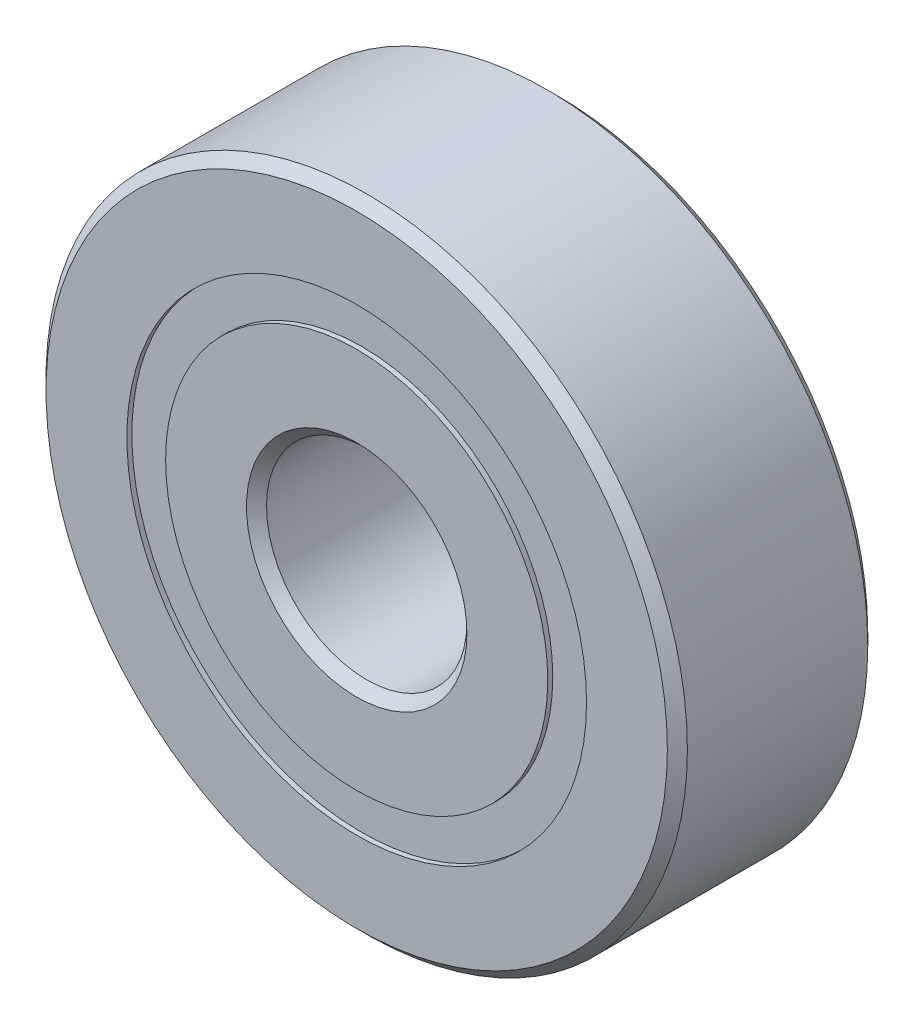
ISO-10303-21;
HEADER;
FILE_DESCRIPTION(('STEP AP214'),'2;1');
FILE_NAME('part.step','',(''),(''),'','','');
FILE_SCHEMA(('AUTOMOTIVE_DESIGN { 1 0 10303 214 1 1 1 1 }'));
ENDSEC;
DATA;
#1=APPLICATION_CONTEXT('core data for automotive mechanical design processes');
#2=APPLICATION_PROTOCOL_DEFINITION('international standard','automotive_design',2000,#1);
#3=PRODUCT_CONTEXT('',#1,'mechanical');
#4=PRODUCT('Part','Part','',(#3));
#5=PRODUCT_RELATED_PRODUCT_CATEGORY('part','',(#4));
#6=PRODUCT_DEFINITION_FORMATION('','',#4);
#7=PRODUCT_DEFINITION_CONTEXT('part definition',#1,'design');
#8=PRODUCT_DEFINITION('design','',#6,#7);
#9=PRODUCT_DEFINITION_SHAPE('','',#8);
#10=(LENGTH_UNIT() NAMED_UNIT(*) SI_UNIT(.MILLI.,.METRE.));
#11=(NAMED_UNIT(*) PLANE_ANGLE_UNIT() SI_UNIT($,.RADIAN.));
#12=(NAMED_UNIT(*) SI_UNIT($,.STERADIAN.) SOLID_ANGLE_UNIT());
#13=UNCERTAINTY_MEASURE_WITH_UNIT(LENGTH_MEASURE(1.E-05),#10,'distance_accuracy_value','');
#14=(GEOMETRIC_REPRESENTATION_CONTEXT(3) GLOBAL_UNCERTAINTY_ASSIGNED_CONTEXT((#13)) GLOBAL_UNIT_ASSIGNED_CONTEXT((#10,
#11,#12)) REPRESENTATION_CONTEXT('',''));
#15=CARTESIAN_POINT('',(0.,0.,0.));
#16=DIRECTION('',(0.,0.,1.));
#17=DIRECTION('',(1.,0.,0.));
#18=AXIS2_PLACEMENT_3D('',#15,#16,#17);
#19=CARTESIAN_POINT('',(0.,5.73351648351648,-2.375));
#20=DIRECTION('',(0.,0.,1.));
#21=DIRECTION('',(1.,0.,0.));
#22=AXIS2_PLACEMENT_3D('',#19,#20,#21);
#23=PLANE('',#22);
#24=CARTESIAN_POINT('',(0.,0.,-2.375));
#25=DIRECTION('',(0.,0.,1.));
#26=DIRECTION('',(1.,0.,0.));
#27=AXIS2_PLACEMENT_3D('',#24,#25,#26);
#28=CIRCLE('',#27,5.73351648351648);
#29=CARTESIAN_POINT('',(5.73351648351648,0.,-2.375));
#30=VERTEX_POINT('',#29);
#31=EDGE_CURVE('E57',#30,#30,#28,.T.);
#32=ORIENTED_EDGE('',*,*,#31,.F.);
#33=EDGE_LOOP('',(#32));
#34=FACE_BOUND('',#33,.T.);
#35=CARTESIAN_POINT('',(0.,0.,-2.375));
#36=DIRECTION('',(0.,0.,1.));
#37=DIRECTION('',(1.,0.,0.));
#38=AXIS2_PLACEMENT_3D('',#35,#36,#37);
#39=CIRCLE('',#38,4.76648351648352);
#40=CARTESIAN_POINT('',(4.76648351648352,0.,-2.375));
#41=VERTEX_POINT('',#40);
#42=EDGE_CURVE('E11',#41,#41,#39,.T.);
#43=ORIENTED_EDGE('',*,*,#42,.T.);
#44=EDGE_LOOP('',(#43));
#45=FACE_BOUND('',#44,.T.);
#46=ADVANCED_FACE('F43',(#34,#45),#23,.F.);
#47=CARTESIAN_POINT('',(0.,0.,2.5));
#48=DIRECTION('',(0.,0.,1.));
#49=DIRECTION('',(1.,0.,0.));
#50=AXIS2_PLACEMENT_3D('',#47,#48,#49);
#51=CYLINDRICAL_SURFACE('',#50,4.76648351648352);
#52=ORIENTED_EDGE('',*,*,#42,.F.);
#53=EDGE_LOOP('',(#52));
#54=FACE_BOUND('',#53,.T.);
#55=CARTESIAN_POINT('',(0.,0.,-1.21175743903915));
#56=DIRECTION('',(0.,0.,1.));
#57=DIRECTION('',(1.,0.,0.));
#58=AXIS2_PLACEMENT_3D('',#55,#56,#57);
#59=CIRCLE('',#58,4.76648351648352);
#60=CARTESIAN_POINT('',(4.76648351648352,0.,-1.21175743903915));
#61=VERTEX_POINT('',#60);
#62=EDGE_CURVE('E49',#61,#61,#59,.T.);
#63=ORIENTED_EDGE('',*,*,#62,.T.);
#64=EDGE_LOOP('',(#63));
#65=FACE_BOUND('',#64,.T.);
#66=ADVANCED_FACE('F66',(#54,#65),#51,.F.);
#67=CARTESIAN_POINT('',(0.,5.73351648351648,-1.21175743903915));
#68=DIRECTION('',(0.,0.,-1.));
#69=DIRECTION('',(-1.,0.,0.));
#70=AXIS2_PLACEMENT_3D('',#67,#68,#69);
#71=PLANE('',#70);
#72=ORIENTED_EDGE('',*,*,#62,.F.);
#73=EDGE_LOOP('',(#72));
#74=FACE_BOUND('',#73,.T.);
#75=CARTESIAN_POINT('',(0.,0.,-1.21175743903915));
#76=DIRECTION('',(0.,0.,1.));
#77=DIRECTION('',(1.,0.,0.));
#78=AXIS2_PLACEMENT_3D('',#75,#76,#77);
#79=CIRCLE('',#78,5.73351648351648);
#80=CARTESIAN_POINT('',(5.73351648351648,0.,-1.21175743903915));
#81=VERTEX_POINT('',#80);
#82=EDGE_CURVE('E53',#81,#81,#79,.T.);
#83=ORIENTED_EDGE('',*,*,#82,.T.);
#84=EDGE_LOOP('',(#83));
#85=FACE_BOUND('',#84,.T.);
#86=ADVANCED_FACE('F70',(#74,#85),#71,.F.);
#87=CARTESIAN_POINT('',(0.,0.,2.5));
#88=DIRECTION('',(0.,0.,1.));
#89=DIRECTION('',(1.,0.,0.));
#90=AXIS2_PLACEMENT_3D('',#87,#88,#89);
#91=CYLINDRICAL_SURFACE('',#90,5.73351648351648);
#92=ORIENTED_EDGE('',*,*,#82,.F.);
#93=EDGE_LOOP('',(#92));
#94=FACE_BOUND('',#93,.T.);
#95=ORIENTED_EDGE('',*,*,#31,.T.);
#96=EDGE_LOOP('',(#95));
#97=FACE_BOUND('',#96,.T.);
#98=ADVANCED_FACE('F63',(#94,#97),#91,.T.);
#99=CLOSED_SHELL('',(#46,#66,#86,#98));
#100=MANIFOLD_SOLID_BREP('B2',#99);
#101=CARTESIAN_POINT('',(0.,5.73351648351648,2.375));
#102=DIRECTION('',(0.,0.,-1.));
#103=DIRECTION('',(-1.,0.,0.));
#104=AXIS2_PLACEMENT_3D('',#101,#102,#103);
#105=PLANE('',#104);
#106=CARTESIAN_POINT('',(0.,0.,2.375));
#107=DIRECTION('',(0.,0.,1.));
#108=DIRECTION('',(1.,0.,0.));
#109=AXIS2_PLACEMENT_3D('',#106,#107,#108);
#110=CIRCLE('',#109,4.76648351648352);
#111=CARTESIAN_POINT('',(4.76648351648352,0.,2.375));
#112=VERTEX_POINT('',#111);
#113=EDGE_CURVE('E42',#112,#112,#110,.T.);
#114=ORIENTED_EDGE('',*,*,#113,.F.);
#115=EDGE_LOOP('',(#114));
#116=FACE_BOUND('',#115,.T.);
#117=CARTESIAN_POINT('',(0.,0.,2.375));
#118=DIRECTION('',(0.,0.,1.));
#119=DIRECTION('',(1.,0.,0.));
#120=AXIS2_PLACEMENT_3D('',#117,#118,#119);
#121=CIRCLE('',#120,5.73351648351648);
#122=CARTESIAN_POINT('',(5.73351648351648,0.,2.375));
#123=VERTEX_POINT('',#122);
#124=EDGE_CURVE('E124',#123,#123,#121,.T.);
#125=ORIENTED_EDGE('',*,*,#124,.T.);
#126=EDGE_LOOP('',(#125));
#127=FACE_BOUND('',#126,.T.);
#128=ADVANCED_FACE('F110',(#116,#127),#105,.F.);
#129=CARTESIAN_POINT('',(0.,0.,2.5));
#130=DIRECTION('',(0.,0.,1.));
#131=DIRECTION('',(1.,0.,0.));
#132=AXIS2_PLACEMENT_3D('',#129,#130,#131);
#133=CYLINDRICAL_SURFACE('',#132,4.76648351648352);
#134=CARTESIAN_POINT('',(0.,0.,1.21175743903915));
#135=DIRECTION('',(0.,0.,1.));
#136=DIRECTION('',(1.,0.,0.));
#137=AXIS2_PLACEMENT_3D('',#134,#135,#136);
#138=CIRCLE('',#137,4.76648351648352);
#139=CARTESIAN_POINT('',(4.76648351648352,0.,1.21175743903915));
#140=VERTEX_POINT('',#139);
#141=EDGE_CURVE('E116',#140,#140,#138,.T.);
#142=ORIENTED_EDGE('',*,*,#141,.F.);
#143=EDGE_LOOP('',(#142));
#144=FACE_BOUND('',#143,.T.);
#145=ORIENTED_EDGE('',*,*,#113,.T.);
#146=EDGE_LOOP('',(#145));
#147=FACE_BOUND('',#146,.T.);
#148=ADVANCED_FACE('F139',(#144,#147),#133,.F.);
#149=CARTESIAN_POINT('',(0.,5.73351648351648,1.21175743903915));
#150=DIRECTION('',(0.,0.,1.));
#151=DIRECTION('',(1.,0.,0.));
#152=AXIS2_PLACEMENT_3D('',#149,#150,#151);
#153=PLANE('',#152);
#154=CARTESIAN_POINT('',(0.,0.,1.21175743903915));
#155=DIRECTION('',(0.,0.,1.));
#156=DIRECTION('',(1.,0.,0.));
#157=AXIS2_PLACEMENT_3D('',#154,#155,#156);
#158=CIRCLE('',#157,5.73351648351648);
#159=CARTESIAN_POINT('',(5.73351648351648,0.,1.21175743903915));
#160=VERTEX_POINT('',#159);
#161=EDGE_CURVE('E120',#160,#160,#158,.T.);
#162=ORIENTED_EDGE('',*,*,#161,.F.);
#163=EDGE_LOOP('',(#162));
#164=FACE_BOUND('',#163,.T.);
#165=ORIENTED_EDGE('',*,*,#141,.T.);
#166=EDGE_LOOP('',(#165));
#167=FACE_BOUND('',#166,.T.);
#168=ADVANCED_FACE('F134',(#164,#167),#153,.F.);
#169=CARTESIAN_POINT('',(0.,0.,2.5));
#170=DIRECTION('',(0.,0.,1.));
#171=DIRECTION('',(1.,0.,0.));
#172=AXIS2_PLACEMENT_3D('',#169,#170,#171);
#173=CYLINDRICAL_SURFACE('',#172,5.73351648351648);
#174=ORIENTED_EDGE('',*,*,#124,.F.);
#175=EDGE_LOOP('',(#174));
#176=FACE_BOUND('',#175,.T.);
#177=ORIENTED_EDGE('',*,*,#161,.T.);
#178=EDGE_LOOP('',(#177));
#179=FACE_BOUND('',#178,.T.);
#180=ADVANCED_FACE('F131',(#176,#179),#173,.T.);
#181=CLOSED_SHELL('',(#128,#148,#168,#180));
#182=MANIFOLD_SOLID_BREP('B6',#181);
#183=CARTESIAN_POINT('',(-3.08587257453543,4.24733922046851,0.));
#184=DIRECTION('',(0.,0.,1.));
#185=DIRECTION('',(-0.587785252292462,0.809016994374955,0.));
#186=AXIS2_PLACEMENT_3D('',#183,#184,#185);
#187=SPHERICAL_SURFACE('',#186,1.21175743903915);
#188=CARTESIAN_POINT('',(-3.08587257453543,4.24733922046851,1.21175743903915));
#189=VERTEX_POINT('',#188);
#190=VERTEX_LOOP('',#189);
#191=FACE_BOUND('',#190,.T.);
#192=ADVANCED_FACE('F177',(#191),#187,.T.);
#193=CLOSED_SHELL('',(#192));
#194=MANIFOLD_SOLID_BREP('B37',#193);
#195=CARTESIAN_POINT('',(-4.99304671054954,1.62233922046853,0.));
#196=DIRECTION('',(0.,0.,1.));
#197=DIRECTION('',(-0.95105651629515,0.309016994374958,0.));
#198=AXIS2_PLACEMENT_3D('',#195,#196,#197);
#199=SPHERICAL_SURFACE('',#198,1.21175743903915);
#200=CARTESIAN_POINT('',(-4.99304671054954,1.62233922046853,1.21175743903915));
#201=VERTEX_POINT('',#200);
#202=VERTEX_LOOP('',#201);
#203=FACE_BOUND('',#202,.T.);
#204=ADVANCED_FACE('F197',(#203),#199,.T.);
#205=CLOSED_SHELL('',(#204));
#206=MANIFOLD_SOLID_BREP('B106',#205);
#207=CARTESIAN_POINT('',(-4.99304671054957,-1.62233922046843,0.));
#208=DIRECTION('',(0.,0.,1.));
#209=DIRECTION('',(-0.951056516295157,-0.309016994374938,0.));
#210=AXIS2_PLACEMENT_3D('',#207,#208,#209);
#211=SPHERICAL_SURFACE('',#210,1.21175743903915);
#212=CARTESIAN_POINT('',(-4.99304671054957,-1.62233922046843,1.21175743903915));
#213=VERTEX_POINT('',#212);
#214=VERTEX_LOOP('',#213);
#215=FACE_BOUND('',#214,.T.);
#216=ADVANCED_FACE('F217',(#215),#211,.T.);
#217=CLOSED_SHELL('',(#216));
#218=MANIFOLD_SOLID_BREP('B173',#217);
#219=CARTESIAN_POINT('',(-3.08587257453552,-4.24733922046845,0.));
#220=DIRECTION('',(0.,0.,1.));
#221=DIRECTION('',(-0.58778525229248,-0.809016994374942,0.));
#222=AXIS2_PLACEMENT_3D('',#219,#220,#221);
#223=SPHERICAL_SURFACE('',#222,1.21175743903915);
#224=CARTESIAN_POINT('',(-3.08587257453552,-4.24733922046845,1.21175743903915));
#225=VERTEX_POINT('',#224);
#226=VERTEX_LOOP('',#225);
#227=FACE_BOUND('',#226,.T.);
#228=ADVANCED_FACE('F237',(#227),#223,.T.);
#229=CLOSED_SHELL('',(#228));
#230=MANIFOLD_SOLID_BREP('B193',#229);
#231=CARTESIAN_POINT('',(0.,-5.25,0.));
#232=DIRECTION('',(0.,0.,1.));
#233=DIRECTION('',(0.,-1.,0.));
#234=AXIS2_PLACEMENT_3D('',#231,#232,#233);
#235=SPHERICAL_SURFACE('',#234,1.21175743903915);
#236=CARTESIAN_POINT('',(0.,-5.25,1.21175743903915));
#237=VERTEX_POINT('',#236);
#238=VERTEX_LOOP('',#237);
#239=FACE_BOUND('',#238,.T.);
#240=ADVANCED_FACE('F257',(#239),#235,.T.);
#241=CLOSED_SHELL('',(#240));
#242=MANIFOLD_SOLID_BREP('B213',#241);
#243=CARTESIAN_POINT('',(3.08587257453546,-4.24733922046849,0.));
#244=DIRECTION('',(0.,0.,1.));
#245=DIRECTION('',(0.587785252292469,-0.809016994374951,0.));
#246=AXIS2_PLACEMENT_3D('',#243,#244,#245);
#247=SPHERICAL_SURFACE('',#246,1.21175743903915);
#248=CARTESIAN_POINT('',(3.08587257453546,-4.24733922046849,1.21175743903915));
#249=VERTEX_POINT('',#248);
#250=VERTEX_LOOP('',#249);
#251=FACE_BOUND('',#250,.T.);
#252=ADVANCED_FACE('F277',(#251),#247,.T.);
#253=CLOSED_SHELL('',(#252));
#254=MANIFOLD_SOLID_BREP('B233',#253);
#255=CARTESIAN_POINT('',(4.99304671054955,-1.6223392204685,0.));
#256=DIRECTION('',(0.,0.,1.));
#257=DIRECTION('',(0.951056516295152,-0.309016994374952,0.));
#258=AXIS2_PLACEMENT_3D('',#255,#256,#257);
#259=SPHERICAL_SURFACE('',#258,1.21175743903915);
#260=CARTESIAN_POINT('',(4.99304671054955,-1.6223392204685,1.21175743903915));
#261=VERTEX_POINT('',#260);
#262=VERTEX_LOOP('',#261);
#263=FACE_BOUND('',#262,.T.);
#264=ADVANCED_FACE('F297',(#263),#259,.T.);
#265=CLOSED_SHELL('',(#264));
#266=MANIFOLD_SOLID_BREP('B253',#265);
#267=CARTESIAN_POINT('',(4.99304671054956,1.62233922046846,0.));
#268=DIRECTION('',(0.,0.,1.));
#269=DIRECTION('',(0.951056516295155,0.309016994374945,0.));
#270=AXIS2_PLACEMENT_3D('',#267,#268,#269);
#271=SPHERICAL_SURFACE('',#270,1.21175743903915);
#272=CARTESIAN_POINT('',(4.99304671054956,1.62233922046846,1.21175743903915));
#273=VERTEX_POINT('',#272);
#274=VERTEX_LOOP('',#273);
#275=FACE_BOUND('',#274,.T.);
#276=ADVANCED_FACE('F317',(#275),#271,.T.);
#277=CLOSED_SHELL('',(#276));
#278=MANIFOLD_SOLID_BREP('B273',#277);
#279=CARTESIAN_POINT('',(3.08587257453549,4.24733922046847,0.));
#280=DIRECTION('',(0.,0.,1.));
#281=DIRECTION('',(0.587785252292474,0.809016994374947,0.));
#282=AXIS2_PLACEMENT_3D('',#279,#280,#281);
#283=SPHERICAL_SURFACE('',#282,1.21175743903915);
#284=CARTESIAN_POINT('',(3.08587257453549,4.24733922046847,1.21175743903915));
#285=VERTEX_POINT('',#284);
#286=VERTEX_LOOP('',#285);
#287=FACE_BOUND('',#286,.T.);
#288=ADVANCED_FACE('F337',(#287),#283,.T.);
#289=CLOSED_SHELL('',(#288));
#290=MANIFOLD_SOLID_BREP('B293',#289);
#291=CARTESIAN_POINT('',(0.,5.25,0.));
#292=DIRECTION('',(0.,0.,1.));
#293=DIRECTION('',(0.,1.,0.));
#294=AXIS2_PLACEMENT_3D('',#291,#292,#293);
#295=SPHERICAL_SURFACE('',#294,1.21175743903915);
#296=CARTESIAN_POINT('',(0.,5.25,1.21175743903915));
#297=VERTEX_POINT('',#296);
#298=VERTEX_LOOP('',#297);
#299=FACE_BOUND('',#298,.T.);
#300=ADVANCED_FACE('F359',(#299),#295,.T.);
#301=CLOSED_SHELL('',(#300));
#302=MANIFOLD_SOLID_BREP('B313',#301);
#303=CARTESIAN_POINT('',(0.,4.76648351648352,2.5));
#304=DIRECTION('',(0.,0.,-1.));
#305=DIRECTION('',(-1.,0.,0.));
#306=AXIS2_PLACEMENT_3D('',#303,#304,#305);
#307=PLANE('',#306);
#308=CARTESIAN_POINT('',(0.,0.,2.5));
#309=DIRECTION('',(0.,0.,1.));
#310=DIRECTION('',(1.,0.,0.));
#311=AXIS2_PLACEMENT_3D('',#308,#309,#310);
#312=CIRCLE('',#311,2.75);
#313=CARTESIAN_POINT('',(2.75,0.,2.5));
#314=VERTEX_POINT('',#313);
#315=EDGE_CURVE('E406',#314,#314,#312,.T.);
#316=ORIENTED_EDGE('',*,*,#315,.F.);
#317=EDGE_LOOP('',(#316));
#318=FACE_BOUND('',#317,.T.);
#319=CARTESIAN_POINT('',(0.,0.,2.5));
#320=DIRECTION('',(0.,0.,1.));
#321=DIRECTION('',(1.,0.,0.));
#322=AXIS2_PLACEMENT_3D('',#319,#320,#321);
#323=CIRCLE('',#322,4.76648351648352);
#324=CARTESIAN_POINT('',(4.76648351648352,0.,2.5));
#325=VERTEX_POINT('',#324);
#326=EDGE_CURVE('E358',#325,#325,#323,.T.);
#327=ORIENTED_EDGE('',*,*,#326,.T.);
#328=EDGE_LOOP('',(#327));
#329=FACE_BOUND('',#328,.T.);
#330=ADVANCED_FACE('F378',(#318,#329),#307,.F.);
#331=CARTESIAN_POINT('',(0.,0.,2.5));
#332=DIRECTION('',(0.,0.,1.));
#333=DIRECTION('',(1.,0.,0.));
#334=AXIS2_PLACEMENT_3D('',#331,#332,#333);
#335=CYLINDRICAL_SURFACE('',#334,4.76648351648352);
#336=ORIENTED_EDGE('',*,*,#326,.F.);
#337=EDGE_LOOP('',(#336));
#338=FACE_BOUND('',#337,.T.);
#339=CARTESIAN_POINT('',(0.,0.,1.11111111111111));
#340=DIRECTION('',(0.,0.,1.));
#341=DIRECTION('',(1.,0.,0.));
#342=AXIS2_PLACEMENT_3D('',#339,#340,#341);
#343=CIRCLE('',#342,4.76648351648352);
#344=CARTESIAN_POINT('',(4.76648351648352,0.,1.11111111111111));
#345=VERTEX_POINT('',#344);
#346=EDGE_CURVE('E384',#345,#345,#343,.T.);
#347=ORIENTED_EDGE('',*,*,#346,.T.);
#348=EDGE_LOOP('',(#347));
#349=FACE_BOUND('',#348,.T.);
#350=ADVANCED_FACE('F413',(#338,#349),#335,.T.);
#351=CARTESIAN_POINT('',(0.,0.,0.));
#352=DIRECTION('',(0.,0.,1.));
#353=DIRECTION('',(1.,0.,0.));
#354=AXIS2_PLACEMENT_3D('',#351,#352,#353);
#355=TOROIDAL_SURFACE('',#354,5.25,1.21175743903915);
#356=ORIENTED_EDGE('',*,*,#346,.F.);
#357=EDGE_LOOP('',(#356));
#358=FACE_BOUND('',#357,.T.);
#359=CARTESIAN_POINT('',(0.,0.,-1.11111111111111));
#360=DIRECTION('',(0.,0.,1.));
#361=DIRECTION('',(1.,0.,0.));
#362=AXIS2_PLACEMENT_3D('',#359,#360,#361);
#363=CIRCLE('',#362,4.76648351648352);
#364=CARTESIAN_POINT('',(4.76648351648352,0.,-1.11111111111111));
#365=VERTEX_POINT('',#364);
#366=EDGE_CURVE('E388',#365,#365,#363,.T.);
#367=ORIENTED_EDGE('',*,*,#366,.T.);
#368=EDGE_LOOP('',(#367));
#369=FACE_BOUND('',#368,.T.);
#370=ADVANCED_FACE('F417',(#358,#369),#355,.F.);
#371=CARTESIAN_POINT('',(0.,0.,2.5));
#372=DIRECTION('',(0.,0.,1.));
#373=DIRECTION('',(1.,0.,0.));
#374=AXIS2_PLACEMENT_3D('',#371,#372,#373);
#375=CYLINDRICAL_SURFACE('',#374,4.76648351648352);
#376=ORIENTED_EDGE('',*,*,#366,.F.);
#377=EDGE_LOOP('',(#376));
#378=FACE_BOUND('',#377,.T.);
#379=CARTESIAN_POINT('',(0.,0.,-2.5));
#380=DIRECTION('',(0.,0.,1.));
#381=DIRECTION('',(1.,0.,0.));
#382=AXIS2_PLACEMENT_3D('',#379,#380,#381);
#383=CIRCLE('',#382,4.76648351648352);
#384=CARTESIAN_POINT('',(4.76648351648352,0.,-2.5));
#385=VERTEX_POINT('',#384);
#386=EDGE_CURVE('E392',#385,#385,#383,.T.);
#387=ORIENTED_EDGE('',*,*,#386,.T.);
#388=EDGE_LOOP('',(#387));
#389=FACE_BOUND('',#388,.T.);
#390=ADVANCED_FACE('F422',(#378,#389),#375,.T.);
#391=CARTESIAN_POINT('',(0.,2.75,-2.5));
#392=DIRECTION('',(0.,0.,1.));
#393=DIRECTION('',(1.,0.,0.));
#394=AXIS2_PLACEMENT_3D('',#391,#392,#393);
#395=PLANE('',#394);
#396=ORIENTED_EDGE('',*,*,#386,.F.);
#397=EDGE_LOOP('',(#396));
#398=FACE_BOUND('',#397,.T.);
#399=CARTESIAN_POINT('',(0.,0.,-2.5));
#400=DIRECTION('',(0.,0.,1.));
#401=DIRECTION('',(1.,0.,0.));
#402=AXIS2_PLACEMENT_3D('',#399,#400,#401);
#403=CIRCLE('',#402,2.75);
#404=CARTESIAN_POINT('',(2.75,0.,-2.5));
#405=VERTEX_POINT('',#404);
#406=EDGE_CURVE('E397',#405,#405,#403,.T.);
#407=ORIENTED_EDGE('',*,*,#406,.T.);
#408=EDGE_LOOP('',(#407));
#409=FACE_BOUND('',#408,.T.);
#410=ADVANCED_FACE('F428',(#398,#409),#395,.F.);
#411=CARTESIAN_POINT('',(0.,0.,-2.25));
#412=DIRECTION('',(0.,0.,-1.));
#413=DIRECTION('',(-1.,0.,0.));
#414=AXIS2_PLACEMENT_3D('',#411,#412,#413);
#415=CONICAL_SURFACE('',#414,2.5,0.785398163397447);
#416=ORIENTED_EDGE('',*,*,#406,.F.);
#417=EDGE_LOOP('',(#416));
#418=FACE_BOUND('',#417,.T.);
#419=CARTESIAN_POINT('',(0.,0.,-2.25));
#420=DIRECTION('',(0.,0.,1.));
#421=DIRECTION('',(1.,0.,0.));
#422=AXIS2_PLACEMENT_3D('',#419,#420,#421);
#423=CIRCLE('',#422,2.5);
#424=CARTESIAN_POINT('',(2.5,0.,-2.25));
#425=VERTEX_POINT('',#424);
#426=EDGE_CURVE('E400',#425,#425,#423,.T.);
#427=ORIENTED_EDGE('',*,*,#426,.T.);
#428=EDGE_LOOP('',(#427));
#429=FACE_BOUND('',#428,.T.);
#430=ADVANCED_FACE('F432',(#418,#429),#415,.F.);
#431=CARTESIAN_POINT('',(0.,0.,2.5));
#432=DIRECTION('',(0.,0.,1.));
#433=DIRECTION('',(1.,0.,0.));
#434=AXIS2_PLACEMENT_3D('',#431,#432,#433);
#435=CYLINDRICAL_SURFACE('',#434,2.5);
#436=ORIENTED_EDGE('',*,*,#426,.F.);
#437=EDGE_LOOP('',(#436));
#438=FACE_BOUND('',#437,.T.);
#439=CARTESIAN_POINT('',(0.,0.,2.25));
#440=DIRECTION('',(0.,0.,1.));
#441=DIRECTION('',(1.,0.,0.));
#442=AXIS2_PLACEMENT_3D('',#439,#440,#441);
#443=CIRCLE('',#442,2.5);
#444=CARTESIAN_POINT('',(2.5,0.,2.25));
#445=VERTEX_POINT('',#444);
#446=EDGE_CURVE('E403',#445,#445,#443,.T.);
#447=ORIENTED_EDGE('',*,*,#446,.T.);
#448=EDGE_LOOP('',(#447));
#449=FACE_BOUND('',#448,.T.);
#450=ADVANCED_FACE('F436',(#438,#449),#435,.F.);
#451=CARTESIAN_POINT('',(0.,0.,2.5));
#452=DIRECTION('',(0.,0.,1.));
#453=DIRECTION('',(1.,0.,0.));
#454=AXIS2_PLACEMENT_3D('',#451,#452,#453);
#455=CONICAL_SURFACE('',#454,2.75,0.785398163397452);
#456=ORIENTED_EDGE('',*,*,#446,.F.);
#457=EDGE_LOOP('',(#456));
#458=FACE_BOUND('',#457,.T.);
#459=ORIENTED_EDGE('',*,*,#315,.T.);
#460=EDGE_LOOP('',(#459));
#461=FACE_BOUND('',#460,.T.);
#462=ADVANCED_FACE('F410',(#458,#461),#455,.F.);
#463=CLOSED_SHELL('',(#330,#350,#370,#390,#410,#430,#450,#462));
#464=MANIFOLD_SOLID_BREP('B333',#463);
#465=CARTESIAN_POINT('',(0.,0.,2.25));
#466=DIRECTION('',(0.,0.,-1.));
#467=DIRECTION('',(-1.,0.,0.));
#468=AXIS2_PLACEMENT_3D('',#465,#466,#467);
#469=CONICAL_SURFACE('',#468,8.,0.785398163397445);
#470=CARTESIAN_POINT('',(0.,0.,2.5));
#471=DIRECTION('',(0.,0.,1.));
#472=DIRECTION('',(1.,0.,0.));
#473=AXIS2_PLACEMENT_3D('',#470,#471,#472);
#474=CIRCLE('',#473,7.75);
#475=CARTESIAN_POINT('',(7.75,0.,2.5));
#476=VERTEX_POINT('',#475);
#477=EDGE_CURVE('E527',#476,#476,#474,.T.);
#478=ORIENTED_EDGE('',*,*,#477,.F.);
#479=EDGE_LOOP('',(#478));
#480=FACE_BOUND('',#479,.T.);
#481=CARTESIAN_POINT('',(0.,0.,2.25));
#482=DIRECTION('',(0.,0.,1.));
#483=DIRECTION('',(1.,0.,0.));
#484=AXIS2_PLACEMENT_3D('',#481,#482,#483);
#485=CIRCLE('',#484,8.);
#486=CARTESIAN_POINT('',(8.,0.,2.25));
#487=VERTEX_POINT('',#486);
#488=EDGE_CURVE('E377',#487,#487,#485,.T.);
#489=ORIENTED_EDGE('',*,*,#488,.T.);
#490=EDGE_LOOP('',(#489));
#491=FACE_BOUND('',#490,.T.);
#492=ADVANCED_FACE('F499',(#480,#491),#469,.T.);
#493=CARTESIAN_POINT('',(0.,0.,2.5));
#494=DIRECTION('',(0.,0.,1.));
#495=DIRECTION('',(1.,0.,0.));
#496=AXIS2_PLACEMENT_3D('',#493,#494,#495);
#497=CYLINDRICAL_SURFACE('',#496,8.);
#498=ORIENTED_EDGE('',*,*,#488,.F.);
#499=EDGE_LOOP('',(#498));
#500=FACE_BOUND('',#499,.T.);
#501=CARTESIAN_POINT('',(0.,0.,-2.25));
#502=DIRECTION('',(0.,0.,1.));
#503=DIRECTION('',(1.,0.,0.));
#504=AXIS2_PLACEMENT_3D('',#501,#502,#503);
#505=CIRCLE('',#504,8.);
#506=CARTESIAN_POINT('',(8.,0.,-2.25));
#507=VERTEX_POINT('',#506);
#508=EDGE_CURVE('E505',#507,#507,#505,.T.);
#509=ORIENTED_EDGE('',*,*,#508,.T.);
#510=EDGE_LOOP('',(#509));
#511=FACE_BOUND('',#510,.T.);
#512=ADVANCED_FACE('F534',(#500,#511),#497,.T.);
#513=CARTESIAN_POINT('',(0.,0.,-2.5));
#514=DIRECTION('',(0.,0.,1.));
#515=DIRECTION('',(1.,0.,0.));
#516=AXIS2_PLACEMENT_3D('',#513,#514,#515);
#517=CONICAL_SURFACE('',#516,7.75,0.785398163397443);
#518=ORIENTED_EDGE('',*,*,#508,.F.);
#519=EDGE_LOOP('',(#518));
#520=FACE_BOUND('',#519,.T.);
#521=CARTESIAN_POINT('',(0.,0.,-2.5));
#522=DIRECTION('',(0.,0.,1.));
#523=DIRECTION('',(1.,0.,0.));
#524=AXIS2_PLACEMENT_3D('',#521,#522,#523);
#525=CIRCLE('',#524,7.75);
#526=CARTESIAN_POINT('',(7.75,0.,-2.5));
#527=VERTEX_POINT('',#526);
#528=EDGE_CURVE('E509',#527,#527,#525,.T.);
#529=ORIENTED_EDGE('',*,*,#528,.T.);
#530=EDGE_LOOP('',(#529));
#531=FACE_BOUND('',#530,.T.);
#532=ADVANCED_FACE('F538',(#520,#531),#517,.T.);
#533=CARTESIAN_POINT('',(0.,7.75,-2.5));
#534=DIRECTION('',(0.,0.,1.));
#535=DIRECTION('',(1.,0.,0.));
#536=AXIS2_PLACEMENT_3D('',#533,#534,#535);
#537=PLANE('',#536);
#538=ORIENTED_EDGE('',*,*,#528,.F.);
#539=EDGE_LOOP('',(#538));
#540=FACE_BOUND('',#539,.T.);
#541=CARTESIAN_POINT('',(0.,0.,-2.5));
#542=DIRECTION('',(0.,0.,1.));
#543=DIRECTION('',(1.,0.,0.));
#544=AXIS2_PLACEMENT_3D('',#541,#542,#543);
#545=CIRCLE('',#544,5.73351648351648);
#546=CARTESIAN_POINT('',(5.73351648351648,0.,-2.5));
#547=VERTEX_POINT('',#546);
#548=EDGE_CURVE('E513',#547,#547,#545,.T.);
#549=ORIENTED_EDGE('',*,*,#548,.T.);
#550=EDGE_LOOP('',(#549));
#551=FACE_BOUND('',#550,.T.);
#552=ADVANCED_FACE('F543',(#540,#551),#537,.F.);
#553=CARTESIAN_POINT('',(0.,0.,2.5));
#554=DIRECTION('',(0.,0.,1.));
#555=DIRECTION('',(1.,0.,0.));
#556=AXIS2_PLACEMENT_3D('',#553,#554,#555);
#557=CYLINDRICAL_SURFACE('',#556,5.73351648351648);
#558=ORIENTED_EDGE('',*,*,#548,.F.);
#559=EDGE_LOOP('',(#558));
#560=FACE_BOUND('',#559,.T.);
#561=CARTESIAN_POINT('',(0.,0.,-1.11111111111111));
#562=DIRECTION('',(0.,0.,1.));
#563=DIRECTION('',(1.,0.,0.));
#564=AXIS2_PLACEMENT_3D('',#561,#562,#563);
#565=CIRCLE('',#564,5.73351648351648);
#566=CARTESIAN_POINT('',(5.73351648351648,0.,-1.11111111111111));
#567=VERTEX_POINT('',#566);
#568=EDGE_CURVE('E518',#567,#567,#565,.T.);
#569=ORIENTED_EDGE('',*,*,#568,.T.);
#570=EDGE_LOOP('',(#569));
#571=FACE_BOUND('',#570,.T.);
#572=ADVANCED_FACE('F549',(#560,#571),#557,.F.);
#573=CARTESIAN_POINT('',(0.,0.,0.));
#574=DIRECTION('',(0.,0.,1.));
#575=DIRECTION('',(1.,0.,0.));
#576=AXIS2_PLACEMENT_3D('',#573,#574,#575);
#577=TOROIDAL_SURFACE('',#576,5.25,1.21175743903915);
#578=ORIENTED_EDGE('',*,*,#568,.F.);
#579=EDGE_LOOP('',(#578));
#580=FACE_BOUND('',#579,.T.);
#581=CARTESIAN_POINT('',(0.,0.,1.11111111111111));
#582=DIRECTION('',(0.,0.,1.));
#583=DIRECTION('',(1.,0.,0.));
#584=AXIS2_PLACEMENT_3D('',#581,#582,#583);
#585=CIRCLE('',#584,5.73351648351648);
#586=CARTESIAN_POINT('',(5.73351648351648,0.,1.11111111111111));
#587=VERTEX_POINT('',#586);
#588=EDGE_CURVE('E521',#587,#587,#585,.T.);
#589=ORIENTED_EDGE('',*,*,#588,.T.);
#590=EDGE_LOOP('',(#589));
#591=FACE_BOUND('',#590,.T.);
#592=ADVANCED_FACE('F553',(#580,#591),#577,.F.);
#593=CARTESIAN_POINT('',(0.,0.,2.5));
#594=DIRECTION('',(0.,0.,1.));
#595=DIRECTION('',(1.,0.,0.));
#596=AXIS2_PLACEMENT_3D('',#593,#594,#595);
#597=CYLINDRICAL_SURFACE('',#596,5.73351648351648);
#598=ORIENTED_EDGE('',*,*,#588,.F.);
#599=EDGE_LOOP('',(#598));
#600=FACE_BOUND('',#599,.T.);
#601=CARTESIAN_POINT('',(0.,0.,2.5));
#602=DIRECTION('',(0.,0.,1.));
#603=DIRECTION('',(1.,0.,0.));
#604=AXIS2_PLACEMENT_3D('',#601,#602,#603);
#605=CIRCLE('',#604,5.73351648351648);
#606=CARTESIAN_POINT('',(5.73351648351648,0.,2.5));
#607=VERTEX_POINT('',#606);
#608=EDGE_CURVE('E524',#607,#607,#605,.T.);
#609=ORIENTED_EDGE('',*,*,#608,.T.);
#610=EDGE_LOOP('',(#609));
#611=FACE_BOUND('',#610,.T.);
#612=ADVANCED_FACE('F557',(#600,#611),#597,.F.);
#613=CARTESIAN_POINT('',(0.,7.75,2.5));
#614=DIRECTION('',(0.,0.,-1.));
#615=DIRECTION('',(-1.,0.,0.));
#616=AXIS2_PLACEMENT_3D('',#613,#614,#615);
#617=PLANE('',#616);
#618=ORIENTED_EDGE('',*,*,#608,.F.);
#619=EDGE_LOOP('',(#618));
#620=FACE_BOUND('',#619,.T.);
#621=ORIENTED_EDGE('',*,*,#477,.T.);
#622=EDGE_LOOP('',(#621));
#623=FACE_BOUND('',#622,.T.);
#624=ADVANCED_FACE('F531',(#620,#623),#617,.F.);
#625=CLOSED_SHELL('',(#492,#512,#532,#552,#572,#592,#612,#624));
#626=MANIFOLD_SOLID_BREP('B353',#625);
#627=ADVANCED_BREP_SHAPE_REPRESENTATION('',(#18,#100,#182,#194,#206,#218,#230,#242,#254,#266,
#278,#290,#302,#464,#626),#14);
#628=SHAPE_DEFINITION_REPRESENTATION(#9,#627);
ENDSEC;
END-ISO-10303-21;
